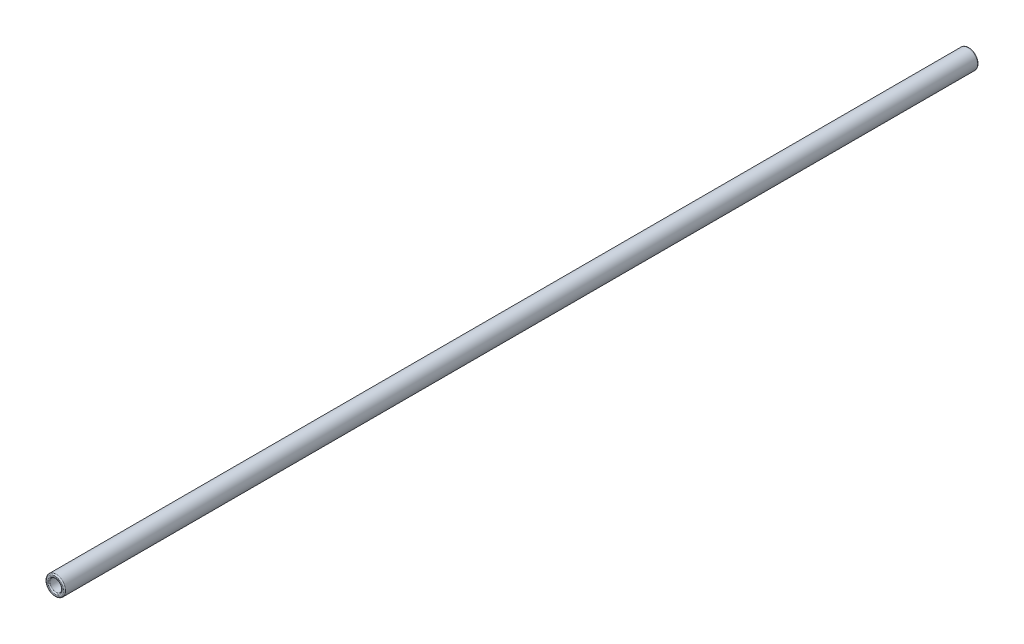
ISO-10303-21;
HEADER;
FILE_DESCRIPTION(('STEP AP214'),'2;1');
FILE_NAME('part.step','',(''),(''),'','','');
FILE_SCHEMA(('AUTOMOTIVE_DESIGN { 1 0 10303 214 1 1 1 1 }'));
ENDSEC;
DATA;
#1=APPLICATION_CONTEXT('core data for automotive mechanical design processes');
#2=APPLICATION_PROTOCOL_DEFINITION('international standard','automotive_design',2000,#1);
#3=PRODUCT_CONTEXT('',#1,'mechanical');
#4=PRODUCT('Part','Part','',(#3));
#5=PRODUCT_RELATED_PRODUCT_CATEGORY('part','',(#4));
#6=PRODUCT_DEFINITION_FORMATION('','',#4);
#7=PRODUCT_DEFINITION_CONTEXT('part definition',#1,'design');
#8=PRODUCT_DEFINITION('design','',#6,#7);
#9=PRODUCT_DEFINITION_SHAPE('','',#8);
#10=(LENGTH_UNIT() NAMED_UNIT(*) SI_UNIT(.MILLI.,.METRE.));
#11=(NAMED_UNIT(*) PLANE_ANGLE_UNIT() SI_UNIT($,.RADIAN.));
#12=(NAMED_UNIT(*) SI_UNIT($,.STERADIAN.) SOLID_ANGLE_UNIT());
#13=UNCERTAINTY_MEASURE_WITH_UNIT(LENGTH_MEASURE(1.E-05),#10,'distance_accuracy_value','');
#14=(GEOMETRIC_REPRESENTATION_CONTEXT(3) GLOBAL_UNCERTAINTY_ASSIGNED_CONTEXT((#13)) GLOBAL_UNIT_ASSIGNED_CONTEXT((#10,
#11,#12)) REPRESENTATION_CONTEXT('',''));
#15=CARTESIAN_POINT('',(0.,0.,0.));
#16=DIRECTION('',(0.,0.,1.));
#17=DIRECTION('',(1.,0.,0.));
#18=AXIS2_PLACEMENT_3D('',#15,#16,#17);
#19=CARTESIAN_POINT('',(0.,0.,820.));
#20=DIRECTION('',(0.,0.,1.));
#21=DIRECTION('',(1.,0.,0.));
#22=AXIS2_PLACEMENT_3D('',#19,#20,#21);
#23=PLANE('',#22);
#24=CARTESIAN_POINT('',(0.,0.,820.));
#25=DIRECTION('',(0.,0.,1.));
#26=DIRECTION('',(1.,0.,0.));
#27=AXIS2_PLACEMENT_3D('',#24,#25,#26);
#28=CIRCLE('',#27,6.477);
#29=CARTESIAN_POINT('',(6.477,0.,820.));
#30=VERTEX_POINT('',#29);
#31=EDGE_CURVE('E56',#30,#30,#28,.F.);
#32=ORIENTED_EDGE('',*,*,#31,.T.);
#33=EDGE_LOOP('',(#32));
#34=FACE_BOUND('',#33,.T.);
#35=CARTESIAN_POINT('',(0.,0.,820.));
#36=DIRECTION('',(0.,0.,1.));
#37=DIRECTION('',(1.,0.,0.));
#38=AXIS2_PLACEMENT_3D('',#35,#36,#37);
#39=CIRCLE('',#38,7.62);
#40=CARTESIAN_POINT('',(7.62,0.,820.));
#41=VERTEX_POINT('',#40);
#42=EDGE_CURVE('E59',#41,#41,#39,.T.);
#43=ORIENTED_EDGE('',*,*,#42,.T.);
#44=EDGE_LOOP('',(#43));
#45=FACE_BOUND('',#44,.T.);
#46=ADVANCED_FACE('F36',(#34,#45),#23,.T.);
#47=CARTESIAN_POINT('',(0.,0.,0.));
#48=DIRECTION('',(0.,0.,1.));
#49=DIRECTION('',(1.,0.,0.));
#50=AXIS2_PLACEMENT_3D('',#47,#48,#49);
#51=PLANE('',#50);
#52=CARTESIAN_POINT('',(0.,0.,0.));
#53=DIRECTION('',(0.,0.,1.));
#54=DIRECTION('',(1.,0.,0.));
#55=AXIS2_PLACEMENT_3D('',#52,#53,#54);
#56=CIRCLE('',#55,6.477);
#57=CARTESIAN_POINT('',(6.477,0.,0.));
#58=VERTEX_POINT('',#57);
#59=EDGE_CURVE('E10',#58,#58,#56,.T.);
#60=ORIENTED_EDGE('',*,*,#59,.T.);
#61=EDGE_LOOP('',(#60));
#62=FACE_BOUND('',#61,.T.);
#63=CARTESIAN_POINT('',(0.,0.,0.));
#64=DIRECTION('',(0.,0.,1.));
#65=DIRECTION('',(1.,0.,0.));
#66=AXIS2_PLACEMENT_3D('',#63,#64,#65);
#67=CIRCLE('',#66,7.62);
#68=CARTESIAN_POINT('',(7.62,0.,0.));
#69=VERTEX_POINT('',#68);
#70=EDGE_CURVE('E43',#69,#69,#67,.F.);
#71=ORIENTED_EDGE('',*,*,#70,.T.);
#72=EDGE_LOOP('',(#71));
#73=FACE_BOUND('',#72,.T.);
#74=ADVANCED_FACE('F84',(#62,#73),#51,.F.);
#75=CARTESIAN_POINT('',(0.,0.,820.));
#76=DIRECTION('',(0.,0.,-1.));
#77=DIRECTION('',(-1.,0.,0.));
#78=AXIS2_PLACEMENT_3D('',#75,#76,#77);
#79=CYLINDRICAL_SURFACE('',#78,8.636);
#80=CARTESIAN_POINT('',(0.,0.,818.984));
#81=DIRECTION('',(0.,0.,1.));
#82=DIRECTION('',(1.,0.,0.));
#83=AXIS2_PLACEMENT_3D('',#80,#81,#82);
#84=CIRCLE('',#83,8.636);
#85=CARTESIAN_POINT('',(-8.636,0.,818.984));
#86=VERTEX_POINT('',#85);
#87=EDGE_CURVE('E47',#86,#86,#84,.F.);
#88=CARTESIAN_POINT('',(0.,0.,1.01600000000002));
#89=DIRECTION('',(0.,0.,1.));
#90=DIRECTION('',(1.,0.,0.));
#91=AXIS2_PLACEMENT_3D('',#88,#89,#90);
#92=CIRCLE('',#91,8.636);
#93=CARTESIAN_POINT('',(-8.636,0.,1.01599999999991));
#94=VERTEX_POINT('',#93);
#95=EDGE_CURVE('E51',#94,#94,#92,.T.);
#96=CARTESIAN_POINT('',(-8.636,0.,818.984));
#97=CARTESIAN_POINT('',(-8.636,0.,810.4635));
#98=CARTESIAN_POINT('',(-8.636,0.,801.943));
#99=CARTESIAN_POINT('',(-8.636,0.,784.902));
#100=CARTESIAN_POINT('',(-8.636,0.,776.3815));
#101=CARTESIAN_POINT('',(-8.636,0.,759.3405));
#102=CARTESIAN_POINT('',(-8.636,0.,750.82));
#103=CARTESIAN_POINT('',(-8.636,0.,733.779));
#104=CARTESIAN_POINT('',(-8.636,0.,725.2585));
#105=CARTESIAN_POINT('',(-8.636,0.,708.2175));
#106=CARTESIAN_POINT('',(-8.636,0.,699.697));
#107=CARTESIAN_POINT('',(-8.636,0.,682.656));
#108=CARTESIAN_POINT('',(-8.636,0.,674.1355));
#109=CARTESIAN_POINT('',(-8.636,0.,657.0945));
#110=CARTESIAN_POINT('',(-8.636,0.,648.574));
#111=CARTESIAN_POINT('',(-8.636,0.,631.533));
#112=CARTESIAN_POINT('',(-8.636,0.,623.0125));
#113=CARTESIAN_POINT('',(-8.636,0.,605.9715));
#114=CARTESIAN_POINT('',(-8.636,0.,597.451));
#115=CARTESIAN_POINT('',(-8.636,0.,580.41));
#116=CARTESIAN_POINT('',(-8.636,0.,571.8895));
#117=CARTESIAN_POINT('',(-8.636,0.,554.8485));
#118=CARTESIAN_POINT('',(-8.636,0.,546.328));
#119=CARTESIAN_POINT('',(-8.636,0.,529.287));
#120=CARTESIAN_POINT('',(-8.636,0.,520.7665));
#121=CARTESIAN_POINT('',(-8.636,0.,503.7255));
#122=CARTESIAN_POINT('',(-8.636,0.,495.205));
#123=CARTESIAN_POINT('',(-8.636,0.,478.164));
#124=CARTESIAN_POINT('',(-8.636,0.,469.6435));
#125=CARTESIAN_POINT('',(-8.636,0.,452.6025));
#126=CARTESIAN_POINT('',(-8.636,0.,444.082));
#127=CARTESIAN_POINT('',(-8.636,0.,427.041));
#128=CARTESIAN_POINT('',(-8.636,0.,418.5205));
#129=CARTESIAN_POINT('',(-8.636,0.,401.4795));
#130=CARTESIAN_POINT('',(-8.636,0.,392.959));
#131=CARTESIAN_POINT('',(-8.636,0.,375.918));
#132=CARTESIAN_POINT('',(-8.636,0.,367.3975));
#133=CARTESIAN_POINT('',(-8.636,0.,350.3565));
#134=CARTESIAN_POINT('',(-8.636,0.,341.836));
#135=CARTESIAN_POINT('',(-8.636,0.,324.795));
#136=CARTESIAN_POINT('',(-8.636,0.,316.2745));
#137=CARTESIAN_POINT('',(-8.636,0.,299.2335));
#138=CARTESIAN_POINT('',(-8.636,0.,290.713));
#139=CARTESIAN_POINT('',(-8.636,0.,273.672));
#140=CARTESIAN_POINT('',(-8.636,0.,265.1515));
#141=CARTESIAN_POINT('',(-8.636,0.,248.1105));
#142=CARTESIAN_POINT('',(-8.636,0.,239.59));
#143=CARTESIAN_POINT('',(-8.636,0.,222.549));
#144=CARTESIAN_POINT('',(-8.636,0.,214.0285));
#145=CARTESIAN_POINT('',(-8.636,0.,196.9875));
#146=CARTESIAN_POINT('',(-8.636,0.,188.467));
#147=CARTESIAN_POINT('',(-8.636,0.,171.426));
#148=CARTESIAN_POINT('',(-8.636,0.,162.9055));
#149=CARTESIAN_POINT('',(-8.636,0.,145.8645));
#150=CARTESIAN_POINT('',(-8.636,0.,137.344));
#151=CARTESIAN_POINT('',(-8.636,0.,120.303));
#152=CARTESIAN_POINT('',(-8.636,0.,111.7825));
#153=CARTESIAN_POINT('',(-8.636,0.,94.7415));
#154=CARTESIAN_POINT('',(-8.636,0.,86.221));
#155=CARTESIAN_POINT('',(-8.636,0.,69.1799999999999));
#156=CARTESIAN_POINT('',(-8.636,0.,60.6594999999999));
#157=CARTESIAN_POINT('',(-8.636,0.,43.6184999999999));
#158=CARTESIAN_POINT('',(-8.636,0.,35.0979999999999));
#159=CARTESIAN_POINT('',(-8.636,0.,18.0569999999999));
#160=CARTESIAN_POINT('',(-8.636,0.,9.53649999999991));
#161=CARTESIAN_POINT('',(-8.636,0.,1.01599999999991));
#162=B_SPLINE_CURVE_WITH_KNOTS('',3,(#96,#97,#98,#99,#100,#101,#102,#103,#104,#105,#106,#107,
#108,#109,#110,#111,#112,#113,#114,#115,#116,#117,#118,#119,#120,#121,#122,#123,#124,#125,#126,
#127,#128,#129,#130,#131,#132,#133,#134,#135,#136,#137,#138,#139,#140,#141,#142,#143,#144,#145,
#146,#147,#148,#149,#150,#151,#152,#153,#154,#155,#156,#157,#158,#159,#160,#161),.UNSPECIFIED.,
.F.,.F.,(4,2,2,2,2,2,2,2,2,2,2,2,2,2,2,2,2,2,2,2,2,2,2,2,2,2,2,2,2,2,2,2,4),(0.,
25.5614999999999,51.1229999999999,76.6844999999999,102.246,127.8075,153.369,178.9305,204.492,
230.0535,255.615,281.1765,306.738,332.2995,357.861,383.4225,408.984,434.5455,460.107,485.6685,
511.23,536.7915,562.353,587.9145,613.476,639.0375,664.599,690.1605,715.722,741.2835,766.845,
792.4065,817.968),.UNSPECIFIED.);
#163=EDGE_CURVE('BSEAM90',#86,#94,#162,.T.);
#164=ORIENTED_EDGE('',*,*,#87,.T.);
#165=ORIENTED_EDGE('',*,*,#95,.T.);
#166=ORIENTED_EDGE('',*,*,#163,.T.);
#167=ORIENTED_EDGE('',*,*,#163,.F.);
#168=EDGE_LOOP('',(#164,#166,#165,#167));
#169=FACE_BOUND('',#168,.T.);
#170=ADVANCED_FACE('F90',(#169),#79,.T.);
#171=CARTESIAN_POINT('',(0.,0.,820.));
#172=DIRECTION('',(0.,0.,-1.));
#173=DIRECTION('',(-1.,0.,0.));
#174=AXIS2_PLACEMENT_3D('',#171,#172,#173);
#175=CYLINDRICAL_SURFACE('',#174,5.461);
#176=CARTESIAN_POINT('',(0.,0.,818.984));
#177=DIRECTION('',(0.,0.,1.));
#178=DIRECTION('',(1.,0.,0.));
#179=AXIS2_PLACEMENT_3D('',#176,#177,#178);
#180=CIRCLE('',#179,5.461);
#181=CARTESIAN_POINT('',(-5.461,0.,818.984));
#182=VERTEX_POINT('',#181);
#183=EDGE_CURVE('E62',#182,#182,#180,.T.);
#184=CARTESIAN_POINT('',(0.,0.,1.01600000000002));
#185=DIRECTION('',(0.,0.,1.));
#186=DIRECTION('',(1.,0.,0.));
#187=AXIS2_PLACEMENT_3D('',#184,#185,#186);
#188=CIRCLE('',#187,5.461);
#189=CARTESIAN_POINT('',(-5.461,0.,1.01599999999991));
#190=VERTEX_POINT('',#189);
#191=EDGE_CURVE('E65',#190,#190,#188,.F.);
#192=CARTESIAN_POINT('',(-5.461,0.,818.984));
#193=CARTESIAN_POINT('',(-5.461,0.,810.4635));
#194=CARTESIAN_POINT('',(-5.461,0.,801.943));
#195=CARTESIAN_POINT('',(-5.461,0.,784.902));
#196=CARTESIAN_POINT('',(-5.461,0.,776.3815));
#197=CARTESIAN_POINT('',(-5.461,0.,759.3405));
#198=CARTESIAN_POINT('',(-5.461,0.,750.82));
#199=CARTESIAN_POINT('',(-5.461,0.,733.779));
#200=CARTESIAN_POINT('',(-5.461,0.,725.2585));
#201=CARTESIAN_POINT('',(-5.461,0.,708.2175));
#202=CARTESIAN_POINT('',(-5.461,0.,699.697));
#203=CARTESIAN_POINT('',(-5.461,0.,682.656));
#204=CARTESIAN_POINT('',(-5.461,0.,674.1355));
#205=CARTESIAN_POINT('',(-5.461,0.,657.0945));
#206=CARTESIAN_POINT('',(-5.461,0.,648.574));
#207=CARTESIAN_POINT('',(-5.461,0.,631.533));
#208=CARTESIAN_POINT('',(-5.461,0.,623.0125));
#209=CARTESIAN_POINT('',(-5.461,0.,605.9715));
#210=CARTESIAN_POINT('',(-5.461,0.,597.451));
#211=CARTESIAN_POINT('',(-5.461,0.,580.41));
#212=CARTESIAN_POINT('',(-5.461,0.,571.8895));
#213=CARTESIAN_POINT('',(-5.461,0.,554.8485));
#214=CARTESIAN_POINT('',(-5.461,0.,546.328));
#215=CARTESIAN_POINT('',(-5.461,0.,529.287));
#216=CARTESIAN_POINT('',(-5.461,0.,520.7665));
#217=CARTESIAN_POINT('',(-5.461,0.,503.7255));
#218=CARTESIAN_POINT('',(-5.461,0.,495.205));
#219=CARTESIAN_POINT('',(-5.461,0.,478.164));
#220=CARTESIAN_POINT('',(-5.461,0.,469.6435));
#221=CARTESIAN_POINT('',(-5.461,0.,452.6025));
#222=CARTESIAN_POINT('',(-5.461,0.,444.082));
#223=CARTESIAN_POINT('',(-5.461,0.,427.041));
#224=CARTESIAN_POINT('',(-5.461,0.,418.5205));
#225=CARTESIAN_POINT('',(-5.461,0.,401.4795));
#226=CARTESIAN_POINT('',(-5.461,0.,392.959));
#227=CARTESIAN_POINT('',(-5.461,0.,375.918));
#228=CARTESIAN_POINT('',(-5.461,0.,367.3975));
#229=CARTESIAN_POINT('',(-5.461,0.,350.3565));
#230=CARTESIAN_POINT('',(-5.461,0.,341.836));
#231=CARTESIAN_POINT('',(-5.461,0.,324.795));
#232=CARTESIAN_POINT('',(-5.461,0.,316.2745));
#233=CARTESIAN_POINT('',(-5.461,0.,299.2335));
#234=CARTESIAN_POINT('',(-5.461,0.,290.713));
#235=CARTESIAN_POINT('',(-5.461,0.,273.672));
#236=CARTESIAN_POINT('',(-5.461,0.,265.1515));
#237=CARTESIAN_POINT('',(-5.461,0.,248.1105));
#238=CARTESIAN_POINT('',(-5.461,0.,239.59));
#239=CARTESIAN_POINT('',(-5.461,0.,222.549));
#240=CARTESIAN_POINT('',(-5.461,0.,214.0285));
#241=CARTESIAN_POINT('',(-5.461,0.,196.9875));
#242=CARTESIAN_POINT('',(-5.461,0.,188.467));
#243=CARTESIAN_POINT('',(-5.461,0.,171.426));
#244=CARTESIAN_POINT('',(-5.461,0.,162.9055));
#245=CARTESIAN_POINT('',(-5.461,0.,145.8645));
#246=CARTESIAN_POINT('',(-5.461,0.,137.344));
#247=CARTESIAN_POINT('',(-5.461,0.,120.303));
#248=CARTESIAN_POINT('',(-5.461,0.,111.7825));
#249=CARTESIAN_POINT('',(-5.461,0.,94.7415));
#250=CARTESIAN_POINT('',(-5.461,0.,86.221));
#251=CARTESIAN_POINT('',(-5.461,0.,69.1799999999999));
#252=CARTESIAN_POINT('',(-5.461,0.,60.6594999999999));
#253=CARTESIAN_POINT('',(-5.461,0.,43.6184999999999));
#254=CARTESIAN_POINT('',(-5.461,0.,35.0979999999999));
#255=CARTESIAN_POINT('',(-5.461,0.,18.0569999999999));
#256=CARTESIAN_POINT('',(-5.461,0.,9.53649999999991));
#257=CARTESIAN_POINT('',(-5.461,0.,1.01599999999991));
#258=B_SPLINE_CURVE_WITH_KNOTS('',3,(#192,#193,#194,#195,#196,#197,#198,#199,#200,#201,#202,
#203,#204,#205,#206,#207,#208,#209,#210,#211,#212,#213,#214,#215,#216,#217,#218,#219,#220,#221,
#222,#223,#224,#225,#226,#227,#228,#229,#230,#231,#232,#233,#234,#235,#236,#237,#238,#239,#240,
#241,#242,#243,#244,#245,#246,#247,#248,#249,#250,#251,#252,#253,#254,#255,#256,#257),
.UNSPECIFIED.,.F.,.F.,(4,2,2,2,2,2,2,2,2,2,2,2,2,2,2,2,2,2,2,2,2,2,2,2,2,2,2,2,2,2,2,2,4),(0.,
25.5614999999999,51.1229999999999,76.6844999999999,102.246,127.8075,153.369,178.9305,204.492,
230.0535,255.615,281.1765,306.738,332.2995,357.861,383.4225,408.984,434.5455,460.107,485.6685,
511.23,536.7915,562.353,587.9145,613.476,639.0375,664.599,690.1605,715.722,741.2835,766.845,
792.4065,817.968),.UNSPECIFIED.);
#259=EDGE_CURVE('BSEAM69',#182,#190,#258,.T.);
#260=ORIENTED_EDGE('',*,*,#183,.T.);
#261=ORIENTED_EDGE('',*,*,#191,.T.);
#262=ORIENTED_EDGE('',*,*,#259,.T.);
#263=ORIENTED_EDGE('',*,*,#259,.F.);
#264=EDGE_LOOP('',(#260,#262,#261,#263));
#265=FACE_BOUND('',#264,.T.);
#266=ADVANCED_FACE('F69',(#265),#175,.F.);
#267=CARTESIAN_POINT('',(0.,0.,818.984));
#268=DIRECTION('',(0.,0.,1.));
#269=DIRECTION('',(1.,0.,0.));
#270=AXIS2_PLACEMENT_3D('',#267,#268,#269);
#271=TOROIDAL_SURFACE('',#270,6.477,1.016);
#272=ORIENTED_EDGE('',*,*,#31,.F.);
#273=EDGE_LOOP('',(#272));
#274=FACE_BOUND('',#273,.T.);
#275=ORIENTED_EDGE('',*,*,#183,.F.);
#276=EDGE_LOOP('',(#275));
#277=FACE_BOUND('',#276,.T.);
#278=ADVANCED_FACE('F80',(#274,#277),#271,.T.);
#279=CARTESIAN_POINT('',(0.,0.,818.984));
#280=DIRECTION('',(0.,0.,1.));
#281=DIRECTION('',(1.,0.,0.));
#282=AXIS2_PLACEMENT_3D('',#279,#280,#281);
#283=TOROIDAL_SURFACE('',#282,7.62,1.016);
#284=ORIENTED_EDGE('',*,*,#87,.F.);
#285=EDGE_LOOP('',(#284));
#286=FACE_BOUND('',#285,.T.);
#287=ORIENTED_EDGE('',*,*,#42,.F.);
#288=EDGE_LOOP('',(#287));
#289=FACE_BOUND('',#288,.T.);
#290=ADVANCED_FACE('F74',(#286,#289),#283,.T.);
#291=CARTESIAN_POINT('',(0.,0.,1.01600000000002));
#292=DIRECTION('',(0.,0.,1.));
#293=DIRECTION('',(1.,0.,0.));
#294=AXIS2_PLACEMENT_3D('',#291,#292,#293);
#295=TOROIDAL_SURFACE('',#294,6.477,1.016);
#296=ORIENTED_EDGE('',*,*,#191,.F.);
#297=EDGE_LOOP('',(#296));
#298=FACE_BOUND('',#297,.T.);
#299=ORIENTED_EDGE('',*,*,#59,.F.);
#300=EDGE_LOOP('',(#299));
#301=FACE_BOUND('',#300,.T.);
#302=ADVANCED_FACE('F71',(#298,#301),#295,.T.);
#303=CARTESIAN_POINT('',(0.,0.,1.01600000000002));
#304=DIRECTION('',(0.,0.,1.));
#305=DIRECTION('',(1.,0.,0.));
#306=AXIS2_PLACEMENT_3D('',#303,#304,#305);
#307=TOROIDAL_SURFACE('',#306,7.62,1.016);
#308=ORIENTED_EDGE('',*,*,#70,.F.);
#309=EDGE_LOOP('',(#308));
#310=FACE_BOUND('',#309,.T.);
#311=ORIENTED_EDGE('',*,*,#95,.F.);
#312=EDGE_LOOP('',(#311));
#313=FACE_BOUND('',#312,.T.);
#314=ADVANCED_FACE('F38',(#310,#313),#307,.T.);
#315=CLOSED_SHELL('',(#46,#74,#170,#266,#278,#290,#302,#314));
#316=MANIFOLD_SOLID_BREP('B2',#315);
#317=ADVANCED_BREP_SHAPE_REPRESENTATION('',(#18,#316),#14);
#318=SHAPE_DEFINITION_REPRESENTATION(#9,#317);
ENDSEC;
END-ISO-10303-21;
